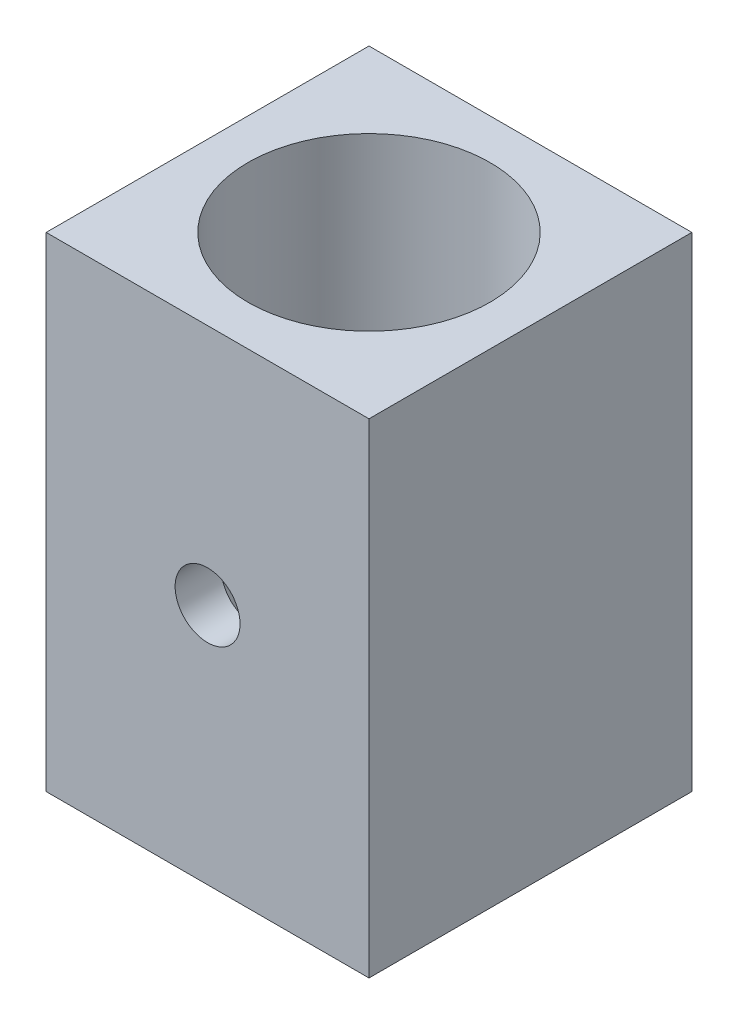
ISO-10303-21;
HEADER;
FILE_DESCRIPTION(('STEP AP214'),'2;1');
FILE_NAME('part.step','',(''),(''),'','','');
FILE_SCHEMA(('AUTOMOTIVE_DESIGN { 1 0 10303 214 1 1 1 1 }'));
ENDSEC;
DATA;
#1=APPLICATION_CONTEXT('core data for automotive mechanical design processes');
#2=APPLICATION_PROTOCOL_DEFINITION('international standard','automotive_design',2000,#1);
#3=PRODUCT_CONTEXT('',#1,'mechanical');
#4=PRODUCT('Part','Part','',(#3));
#5=PRODUCT_RELATED_PRODUCT_CATEGORY('part','',(#4));
#6=PRODUCT_DEFINITION_FORMATION('','',#4);
#7=PRODUCT_DEFINITION_CONTEXT('part definition',#1,'design');
#8=PRODUCT_DEFINITION('design','',#6,#7);
#9=PRODUCT_DEFINITION_SHAPE('','',#8);
#10=(LENGTH_UNIT() NAMED_UNIT(*) SI_UNIT(.MILLI.,.METRE.));
#11=(NAMED_UNIT(*) PLANE_ANGLE_UNIT() SI_UNIT($,.RADIAN.));
#12=(NAMED_UNIT(*) SI_UNIT($,.STERADIAN.) SOLID_ANGLE_UNIT());
#13=UNCERTAINTY_MEASURE_WITH_UNIT(LENGTH_MEASURE(1.E-05),#10,'distance_accuracy_value','');
#14=(GEOMETRIC_REPRESENTATION_CONTEXT(3) GLOBAL_UNCERTAINTY_ASSIGNED_CONTEXT((#13)) GLOBAL_UNIT_ASSIGNED_CONTEXT((#10,
#11,#12)) REPRESENTATION_CONTEXT('',''));
#15=CARTESIAN_POINT('',(0.,0.,0.));
#16=DIRECTION('',(0.,0.,1.));
#17=DIRECTION('',(1.,0.,0.));
#18=AXIS2_PLACEMENT_3D('',#15,#16,#17);
#19=CARTESIAN_POINT('',(0.,38.1,0.));
#20=DIRECTION('',(0.,-1.,0.));
#21=DIRECTION('',(0.,0.,-1.));
#22=AXIS2_PLACEMENT_3D('',#19,#20,#21);
#23=PLANE('',#22);
#24=DIRECTION('',(0.,0.,1.));
#25=VECTOR('',#24,1.);
#26=CARTESIAN_POINT('',(0.,38.1,0.));
#27=LINE('',#26,#25);
#28=CARTESIAN_POINT('',(0.,38.1,-25.4));
#29=VERTEX_POINT('',#28);
#30=CARTESIAN_POINT('',(0.,38.1,0.));
#31=VERTEX_POINT('',#30);
#32=EDGE_CURVE('E92',#29,#31,#27,.T.);
#33=ORIENTED_EDGE('',*,*,#32,.T.);
#34=DIRECTION('',(1.,0.,0.));
#35=VECTOR('',#34,1.);
#36=CARTESIAN_POINT('',(0.,38.1,0.));
#37=LINE('',#36,#35);
#38=CARTESIAN_POINT('',(25.4,38.1,0.));
#39=VERTEX_POINT('',#38);
#40=EDGE_CURVE('E87',#31,#39,#37,.T.);
#41=ORIENTED_EDGE('',*,*,#40,.T.);
#42=DIRECTION('',(0.,0.,-1.));
#43=VECTOR('',#42,1.);
#44=CARTESIAN_POINT('',(25.4,38.1,0.));
#45=LINE('',#44,#43);
#46=CARTESIAN_POINT('',(25.4,38.1,-25.4));
#47=VERTEX_POINT('',#46);
#48=EDGE_CURVE('E90',#39,#47,#45,.T.);
#49=ORIENTED_EDGE('',*,*,#48,.T.);
#50=DIRECTION('',(-1.,0.,0.));
#51=VECTOR('',#50,1.);
#52=CARTESIAN_POINT('',(0.,38.1,-25.4));
#53=LINE('',#52,#51);
#54=EDGE_CURVE('E57',#47,#29,#53,.T.);
#55=ORIENTED_EDGE('',*,*,#54,.T.);
#56=EDGE_LOOP('',(#33,#41,#49,#55));
#57=FACE_BOUND('',#56,.T.);
#58=CARTESIAN_POINT('',(12.7,38.1,-12.7));
#59=DIRECTION('',(0.,1.,0.));
#60=DIRECTION('',(0.,0.,1.));
#61=AXIS2_PLACEMENT_3D('',#58,#59,#60);
#62=CIRCLE('',#61,9.525);
#63=CARTESIAN_POINT('',(12.7,38.1,-3.175));
#64=VERTEX_POINT('',#63);
#65=EDGE_CURVE('E112',#64,#64,#62,.T.);
#66=ORIENTED_EDGE('',*,*,#65,.F.);
#67=EDGE_LOOP('',(#66));
#68=FACE_BOUND('',#67,.T.);
#69=ADVANCED_FACE('F39',(#57,#68),#23,.F.);
#70=CARTESIAN_POINT('',(0.,0.,0.));
#71=DIRECTION('',(0.,-1.,0.));
#72=DIRECTION('',(0.,0.,-1.));
#73=AXIS2_PLACEMENT_3D('',#70,#71,#72);
#74=PLANE('',#73);
#75=DIRECTION('',(0.,0.,1.));
#76=VECTOR('',#75,1.);
#77=CARTESIAN_POINT('',(0.,0.,0.));
#78=LINE('',#77,#76);
#79=CARTESIAN_POINT('',(0.,0.,-25.4));
#80=VERTEX_POINT('',#79);
#81=CARTESIAN_POINT('',(0.,0.,0.));
#82=VERTEX_POINT('',#81);
#83=EDGE_CURVE('E108',#80,#82,#78,.T.);
#84=ORIENTED_EDGE('',*,*,#83,.F.);
#85=DIRECTION('',(-1.,0.,0.));
#86=VECTOR('',#85,1.);
#87=CARTESIAN_POINT('',(0.,0.,-25.4));
#88=LINE('',#87,#86);
#89=CARTESIAN_POINT('',(25.4,0.,-25.4));
#90=VERTEX_POINT('',#89);
#91=EDGE_CURVE('E80',#90,#80,#88,.T.);
#92=ORIENTED_EDGE('',*,*,#91,.F.);
#93=DIRECTION('',(0.,0.,-1.));
#94=VECTOR('',#93,1.);
#95=CARTESIAN_POINT('',(25.4,0.,0.));
#96=LINE('',#95,#94);
#97=CARTESIAN_POINT('',(25.4,0.,0.));
#98=VERTEX_POINT('',#97);
#99=EDGE_CURVE('E74',#98,#90,#96,.T.);
#100=ORIENTED_EDGE('',*,*,#99,.F.);
#101=DIRECTION('',(1.,0.,0.));
#102=VECTOR('',#101,1.);
#103=CARTESIAN_POINT('',(0.,0.,0.));
#104=LINE('',#103,#102);
#105=EDGE_CURVE('E97',#82,#98,#104,.T.);
#106=ORIENTED_EDGE('',*,*,#105,.F.);
#107=EDGE_LOOP('',(#84,#92,#100,#106));
#108=FACE_BOUND('',#107,.T.);
#109=CARTESIAN_POINT('',(12.7,0.,-12.7));
#110=DIRECTION('',(0.,1.,0.));
#111=DIRECTION('',(0.,0.,1.));
#112=AXIS2_PLACEMENT_3D('',#109,#110,#111);
#113=CIRCLE('',#112,9.525);
#114=CARTESIAN_POINT('',(12.7,0.,-3.175));
#115=VERTEX_POINT('',#114);
#116=EDGE_CURVE('E130',#115,#115,#113,.T.);
#117=ORIENTED_EDGE('',*,*,#116,.T.);
#118=EDGE_LOOP('',(#117));
#119=FACE_BOUND('',#118,.T.);
#120=ADVANCED_FACE('F125',(#108,#119),#74,.T.);
#121=CARTESIAN_POINT('',(0.,38.1,0.));
#122=DIRECTION('',(1.,0.,0.));
#123=DIRECTION('',(0.,0.,-1.));
#124=AXIS2_PLACEMENT_3D('',#121,#122,#123);
#125=PLANE('',#124);
#126=ORIENTED_EDGE('',*,*,#83,.T.);
#127=DIRECTION('',(0.,-1.,0.));
#128=VECTOR('',#127,1.);
#129=CARTESIAN_POINT('',(0.,38.1,0.));
#130=LINE('',#129,#128);
#131=EDGE_CURVE('E11',#31,#82,#130,.T.);
#132=ORIENTED_EDGE('',*,*,#131,.F.);
#133=ORIENTED_EDGE('',*,*,#32,.F.);
#134=DIRECTION('',(0.,-1.,0.));
#135=VECTOR('',#134,1.);
#136=CARTESIAN_POINT('',(0.,38.1,-25.4));
#137=LINE('',#136,#135);
#138=EDGE_CURVE('E104',#29,#80,#137,.T.);
#139=ORIENTED_EDGE('',*,*,#138,.T.);
#140=EDGE_LOOP('',(#126,#132,#133,#139));
#141=FACE_BOUND('',#140,.T.);
#142=ADVANCED_FACE('F41',(#141),#125,.F.);
#143=CARTESIAN_POINT('',(0.,38.1,0.));
#144=DIRECTION('',(0.,0.,-1.));
#145=DIRECTION('',(-1.,0.,0.));
#146=AXIS2_PLACEMENT_3D('',#143,#144,#145);
#147=PLANE('',#146);
#148=CARTESIAN_POINT('',(12.7,19.05,0.));
#149=DIRECTION('',(0.,0.,1.));
#150=DIRECTION('',(1.,0.,0.));
#151=AXIS2_PLACEMENT_3D('',#148,#149,#150);
#152=CIRCLE('',#151,2.55269999999999);
#153=CARTESIAN_POINT('',(15.2527,19.05,0.));
#154=VERTEX_POINT('',#153);
#155=EDGE_CURVE('E146',#154,#154,#152,.T.);
#156=ORIENTED_EDGE('',*,*,#155,.F.);
#157=EDGE_LOOP('',(#156));
#158=FACE_BOUND('',#157,.T.);
#159=ORIENTED_EDGE('',*,*,#105,.T.);
#160=DIRECTION('',(0.,-1.,0.));
#161=VECTOR('',#160,1.);
#162=CARTESIAN_POINT('',(25.4,38.1,0.));
#163=LINE('',#162,#161);
#164=EDGE_CURVE('E49',#39,#98,#163,.T.);
#165=ORIENTED_EDGE('',*,*,#164,.F.);
#166=ORIENTED_EDGE('',*,*,#40,.F.);
#167=ORIENTED_EDGE('',*,*,#131,.T.);
#168=EDGE_LOOP('',(#159,#165,#166,#167));
#169=FACE_BOUND('',#168,.T.);
#170=ADVANCED_FACE('F96',(#158,#169),#147,.F.);
#171=CARTESIAN_POINT('',(25.4,38.1,0.));
#172=DIRECTION('',(-1.,0.,0.));
#173=DIRECTION('',(0.,0.,1.));
#174=AXIS2_PLACEMENT_3D('',#171,#172,#173);
#175=PLANE('',#174);
#176=ORIENTED_EDGE('',*,*,#99,.T.);
#177=DIRECTION('',(0.,-1.,0.));
#178=VECTOR('',#177,1.);
#179=CARTESIAN_POINT('',(25.4,38.1,-25.4));
#180=LINE('',#179,#178);
#181=EDGE_CURVE('E99',#47,#90,#180,.T.);
#182=ORIENTED_EDGE('',*,*,#181,.F.);
#183=ORIENTED_EDGE('',*,*,#48,.F.);
#184=ORIENTED_EDGE('',*,*,#164,.T.);
#185=EDGE_LOOP('',(#176,#182,#183,#184));
#186=FACE_BOUND('',#185,.T.);
#187=ADVANCED_FACE('F100',(#186),#175,.F.);
#188=CARTESIAN_POINT('',(0.,38.1,-25.4));
#189=DIRECTION('',(0.,0.,1.));
#190=DIRECTION('',(1.,0.,0.));
#191=AXIS2_PLACEMENT_3D('',#188,#189,#190);
#192=PLANE('',#191);
#193=ORIENTED_EDGE('',*,*,#91,.T.);
#194=ORIENTED_EDGE('',*,*,#138,.F.);
#195=ORIENTED_EDGE('',*,*,#54,.F.);
#196=ORIENTED_EDGE('',*,*,#181,.T.);
#197=EDGE_LOOP('',(#193,#194,#195,#196));
#198=FACE_BOUND('',#197,.T.);
#199=ADVANCED_FACE('F122',(#198),#192,.F.);
#200=CARTESIAN_POINT('',(12.7,38.1,-12.7));
#201=DIRECTION('',(0.,-1.,0.));
#202=DIRECTION('',(0.,0.,-1.));
#203=AXIS2_PLACEMENT_3D('',#200,#201,#202);
#204=CYLINDRICAL_SURFACE('',#203,9.525);
#205=CARTESIAN_POINT('',(15.2527,19.05,-3.52343486319636));
#206=CARTESIAN_POINT('',(15.2526966634099,18.909404950069,-3.5234324522365));
#207=CARTESIAN_POINT('',(15.2410451008121,18.7687747019534,-3.52016843407624));
#208=CARTESIAN_POINT('',(15.1948362308468,18.491577519991,-3.50750457137534));
#209=CARTESIAN_POINT('',(15.1602675816817,18.3550126331008,-3.49810168871048));
#210=CARTESIAN_POINT('',(15.0694439864234,18.0899963205742,-3.47429981822231));
#211=CARTESIAN_POINT('',(15.0132197412307,17.9615337071291,-3.45990790616615));
#212=CARTESIAN_POINT('',(14.8807773215376,17.7158438375186,-3.4277586266576));
#213=CARTESIAN_POINT('',(14.804557536844,17.5986174872212,-3.41000098820324));
#214=CARTESIAN_POINT('',(14.6322285861071,17.3757662550508,-3.37261839981166));
#215=CARTESIAN_POINT('',(14.5357051449298,17.2704672586868,-3.35296007929358));
#216=CARTESIAN_POINT('',(14.3263996731237,17.0773414629572,-3.31427903961173));
#217=CARTESIAN_POINT('',(14.2136159447161,16.9895164903818,-3.29525638707551));
#218=CARTESIAN_POINT('',(13.9727294817964,16.8324707178971,-3.25961739362896));
#219=CARTESIAN_POINT('',(13.8444082547541,16.7635742138833,-3.24304500747501));
#220=CARTESIAN_POINT('',(13.5774853729254,16.6484565752928,-3.21455688212843));
#221=CARTESIAN_POINT('',(13.4388854743307,16.6022315773399,-3.20264034961764));
#222=CARTESIAN_POINT('',(13.1587414698698,16.5348247163876,-3.18504257014508));
#223=CARTESIAN_POINT('',(13.0173395771155,16.5130884262964,-3.17922349876739));
#224=CARTESIAN_POINT('',(12.732784521509,16.4935313328403,-3.17399427639579));
#225=CARTESIAN_POINT('',(12.5896316586793,16.4957064881239,-3.17458304239221));
#226=CARTESIAN_POINT('',(12.30949843906,16.5235208031725,-3.1820023083988));
#227=CARTESIAN_POINT('',(12.1724537358856,16.54856090073,-3.18867344339477));
#228=CARTESIAN_POINT('',(11.9045875159182,16.6204260886353,-3.20731960664645));
#229=CARTESIAN_POINT('',(11.7737663562307,16.6672524274145,-3.21929493885021));
#230=CARTESIAN_POINT('',(11.5205354710861,16.7818179504242,-3.24743970261739));
#231=CARTESIAN_POINT('',(11.3982230318441,16.8497617430458,-3.26364990982414));
#232=CARTESIAN_POINT('',(11.1665319325617,17.0044762815991,-3.29851885621662));
#233=CARTESIAN_POINT('',(11.0571558219421,17.091250729053,-3.31717807651692));
#234=CARTESIAN_POINT('',(10.8508664138528,17.2843407474373,-3.35560636694824));
#235=CARTESIAN_POINT('',(10.7544445623849,17.39117869438,-3.37539191094176));
#236=CARTESIAN_POINT('',(10.5807657006481,17.6197124447476,-3.41332161011688));
#237=CARTESIAN_POINT('',(10.5035098832325,17.7414091722483,-3.43146566309095));
#238=CARTESIAN_POINT('',(10.3699769029448,17.997280170358,-3.46412463028981));
#239=CARTESIAN_POINT('',(10.3138345857188,18.1315280267761,-3.47861602866371));
#240=CARTESIAN_POINT('',(10.2250781517359,18.4080426117874,-3.50203733035668));
#241=CARTESIAN_POINT('',(10.1924581328753,18.5503073191646,-3.51096862871279));
#242=CARTESIAN_POINT('',(10.1525221573701,18.8342180015316,-3.52196094808859));
#243=CARTESIAN_POINT('',(10.1444725747986,18.9757531863904,-3.52422108710477));
#244=CARTESIAN_POINT('',(10.1518836514409,19.2581474912662,-3.52216018986401));
#245=CARTESIAN_POINT('',(10.1673417800684,19.399006682416,-3.51783986198903));
#246=CARTESIAN_POINT('',(10.2206824635106,19.6732152033909,-3.50329727819281));
#247=CARTESIAN_POINT('',(10.2581228360033,19.8066573284443,-3.49319149645167));
#248=CARTESIAN_POINT('',(10.3538674460743,20.0653675310894,-3.46833072035926));
#249=CARTESIAN_POINT('',(10.4121744283916,20.1906345307824,-3.45357511441287));
#250=CARTESIAN_POINT('',(10.5494827676967,20.4325047182466,-3.42066944279374));
#251=CARTESIAN_POINT('',(10.6289142855719,20.5488542398321,-3.40245137067736));
#252=CARTESIAN_POINT('',(10.8056845735786,20.766842100745,-3.36483294456198));
#253=CARTESIAN_POINT('',(10.9030267449514,20.8684776393188,-3.3454323664733));
#254=CARTESIAN_POINT('',(11.1162506270747,21.0572040201332,-3.30694850681972));
#255=CARTESIAN_POINT('',(11.232591050041,21.1437829321437,-3.28789107215289));
#256=CARTESIAN_POINT('',(11.4785793422085,21.2961830240615,-3.25282221421813));
#257=CARTESIAN_POINT('',(11.6082265024088,21.3620053091498,-3.23681062879282));
#258=CARTESIAN_POINT('',(11.8762353978414,21.4704173523977,-3.20974073710526));
#259=CARTESIAN_POINT('',(12.0145229301187,21.513180881718,-3.19864549766305));
#260=CARTESIAN_POINT('',(12.2966634279697,21.574763987458,-3.18249583872043));
#261=CARTESIAN_POINT('',(12.4405151394432,21.593588927322,-3.17744006609203));
#262=CARTESIAN_POINT('',(12.7249199652797,21.606421679289,-3.1740035931625));
#263=CARTESIAN_POINT('',(12.8654372496254,21.6011800790045,-3.1754209997546));
#264=CARTESIAN_POINT('',(13.1435134351258,21.5677732866967,-3.18431432077999));
#265=CARTESIAN_POINT('',(13.2810724491438,21.5396089708153,-3.1917900036565));
#266=CARTESIAN_POINT('',(13.5484148445045,21.4615823245181,-3.21191912921725));
#267=CARTESIAN_POINT('',(13.6782460141707,21.4118736353776,-3.22453587158));
#268=CARTESIAN_POINT('',(13.9277991958749,21.2923063886083,-3.25362847380196));
#269=CARTESIAN_POINT('',(14.0475197761307,21.2224449832751,-3.27010487899369));
#270=CARTESIAN_POINT('',(14.2769422420499,21.0623662226196,-3.3057076980364));
#271=CARTESIAN_POINT('',(14.3862883463808,20.9716522002531,-3.32489343683997));
#272=CARTESIAN_POINT('',(14.5884598544077,20.7733833912961,-3.36351455944989));
#273=CARTESIAN_POINT('',(14.6812808887812,20.6658241648268,-3.38295000782876));
#274=CARTESIAN_POINT('',(14.8498156033886,20.4340359680028,-3.42036893875334));
#275=CARTESIAN_POINT('',(14.9251021696882,20.3094890517948,-3.43831043622789));
#276=CARTESIAN_POINT('',(15.0535609936945,20.0490398561195,-3.47011462826669));
#277=CARTESIAN_POINT('',(15.1067475775659,19.9131450017183,-3.48397996346504));
#278=CARTESIAN_POINT('',(15.1826144819773,19.656479144864,-3.50415729177637));
#279=CARTESIAN_POINT('',(15.2088344616053,19.5368103501679,-3.51132753895367));
#280=CARTESIAN_POINT('',(15.2438776581361,19.2947697178078,-3.52096709988973));
#281=CARTESIAN_POINT('',(15.2527029047439,19.1723981971968,-3.52343696211193));
#282=CARTESIAN_POINT('',(15.2527,19.05,-3.52343486319636));
#283=B_SPLINE_CURVE_WITH_KNOTS('',3,(#205,#206,#207,#208,#209,#210,#211,#212,#213,#214,#215,
#216,#217,#218,#219,#220,#221,#222,#223,#224,#225,#226,#227,#228,#229,#230,#231,#232,#233,#234,
#235,#236,#237,#238,#239,#240,#241,#242,#243,#244,#245,#246,#247,#248,#249,#250,#251,#252,#253,
#254,#255,#256,#257,#258,#259,#260,#261,#262,#263,#264,#265,#266,#267,#268,#269,#270,#271,#272,
#273,#274,#275,#276,#277,#278,#279,#280,#281,#282),.UNSPECIFIED.,.T.,.F.,(4,2,2,2,2,2,2,2,2,2,2,
2,2,2,2,2,2,2,2,2,2,2,2,2,2,2,2,2,2,2,2,2,2,2,2,2,2,2,4),(0.,0.421335020659557,
0.842878718260211,1.26382698468505,1.68480915948389,2.1154004842319,2.54603680074902,
2.98364660501421,3.42118181170964,3.84859855570421,4.27594306171062,4.69240268722929,
5.10888618035061,5.52953789787916,5.95027237749893,6.38404937132402,6.81785335573916,
7.25438267369831,7.69080242163874,8.11405736715001,8.53726675282734,8.95224141892328,
9.36727068976941,9.79150173254869,10.2158134202999,10.6525267460238,11.0892168151402,
11.5225682797685,11.9558226348245,12.3756580595251,12.7954774382166,13.2123509529828,
13.6292834034534,14.0574224048774,14.4856744411054,14.9234656318918,15.3609725830661,
15.7278181124889,16.0946208339925),.UNSPECIFIED.);
#284=CARTESIAN_POINT('',(15.2527,19.05,-3.52343486319636));
#285=VERTEX_POINT('',#284);
#286=EDGE_CURVE('E134',#285,#285,#283,.T.);
#287=ORIENTED_EDGE('',*,*,#286,.F.);
#288=EDGE_LOOP('',(#287));
#289=FACE_BOUND('',#288,.T.);
#290=ORIENTED_EDGE('',*,*,#65,.T.);
#291=EDGE_LOOP('',(#290));
#292=FACE_BOUND('',#291,.T.);
#293=ORIENTED_EDGE('',*,*,#116,.F.);
#294=EDGE_LOOP('',(#293));
#295=FACE_BOUND('',#294,.T.);
#296=ADVANCED_FACE('F152',(#289,#292,#295),#204,.F.);
#297=CARTESIAN_POINT('',(12.7,19.05,0.));
#298=DIRECTION('',(0.,0.,1.));
#299=DIRECTION('',(1.,0.,0.));
#300=AXIS2_PLACEMENT_3D('',#297,#298,#299);
#301=CYLINDRICAL_SURFACE('',#300,2.55269999999999);
#302=ORIENTED_EDGE('',*,*,#155,.T.);
#303=EDGE_LOOP('',(#302));
#304=FACE_BOUND('',#303,.T.);
#305=ORIENTED_EDGE('',*,*,#286,.T.);
#306=EDGE_LOOP('',(#305));
#307=FACE_BOUND('',#306,.T.);
#308=ADVANCED_FACE('F149',(#304,#307),#301,.F.);
#309=CLOSED_SHELL('',(#69,#120,#142,#170,#187,#199,#296,#308));
#310=MANIFOLD_SOLID_BREP('B2',#309);
#311=ADVANCED_BREP_SHAPE_REPRESENTATION('',(#18,#310),#14);
#312=SHAPE_DEFINITION_REPRESENTATION(#9,#311);
ENDSEC;
END-ISO-10303-21;
